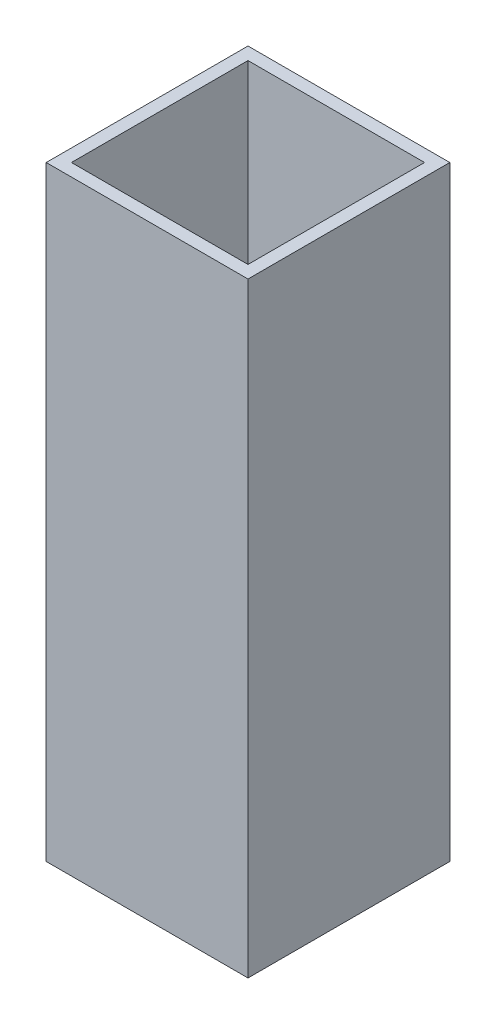
ISO-10303-21;
HEADER;
FILE_DESCRIPTION(('STEP AP214'),'2;1');
FILE_NAME('part.step','',(''),(''),'','','');
FILE_SCHEMA(('AUTOMOTIVE_DESIGN { 1 0 10303 214 1 1 1 1 }'));
ENDSEC;
DATA;
#1=APPLICATION_CONTEXT('core data for automotive mechanical design processes');
#2=APPLICATION_PROTOCOL_DEFINITION('international standard','automotive_design',2000,#1);
#3=PRODUCT_CONTEXT('',#1,'mechanical');
#4=PRODUCT('Part','Part','',(#3));
#5=PRODUCT_RELATED_PRODUCT_CATEGORY('part','',(#4));
#6=PRODUCT_DEFINITION_FORMATION('','',#4);
#7=PRODUCT_DEFINITION_CONTEXT('part definition',#1,'design');
#8=PRODUCT_DEFINITION('design','',#6,#7);
#9=PRODUCT_DEFINITION_SHAPE('','',#8);
#10=(LENGTH_UNIT() NAMED_UNIT(*) SI_UNIT(.MILLI.,.METRE.));
#11=(NAMED_UNIT(*) PLANE_ANGLE_UNIT() SI_UNIT($,.RADIAN.));
#12=(NAMED_UNIT(*) SI_UNIT($,.STERADIAN.) SOLID_ANGLE_UNIT());
#13=UNCERTAINTY_MEASURE_WITH_UNIT(LENGTH_MEASURE(1.E-05),#10,'distance_accuracy_value','');
#14=(GEOMETRIC_REPRESENTATION_CONTEXT(3) GLOBAL_UNCERTAINTY_ASSIGNED_CONTEXT((#13)) GLOBAL_UNIT_ASSIGNED_CONTEXT((#10,
#11,#12)) REPRESENTATION_CONTEXT('',''));
#15=CARTESIAN_POINT('',(0.,0.,0.));
#16=DIRECTION('',(0.,0.,1.));
#17=DIRECTION('',(1.,0.,0.));
#18=AXIS2_PLACEMENT_3D('',#15,#16,#17);
#19=CARTESIAN_POINT('',(0.,76.2,0.));
#20=DIRECTION('',(0.,-1.,0.));
#21=DIRECTION('',(0.,0.,-1.));
#22=AXIS2_PLACEMENT_3D('',#19,#20,#21);
#23=PLANE('',#22);
#24=DIRECTION('',(0.,0.,1.));
#25=VECTOR('',#24,1.);
#26=CARTESIAN_POINT('',(-12.7,76.2,-12.7));
#27=LINE('',#26,#25);
#28=CARTESIAN_POINT('',(-12.7,76.2,-12.7));
#29=VERTEX_POINT('',#28);
#30=CARTESIAN_POINT('',(-12.7,76.2,12.7));
#31=VERTEX_POINT('',#30);
#32=EDGE_CURVE('E134',#29,#31,#27,.T.);
#33=ORIENTED_EDGE('',*,*,#32,.T.);
#34=DIRECTION('',(1.,0.,0.));
#35=VECTOR('',#34,1.);
#36=CARTESIAN_POINT('',(12.7,76.2,12.7));
#37=LINE('',#36,#35);
#38=CARTESIAN_POINT('',(12.7,76.2,12.7));
#39=VERTEX_POINT('',#38);
#40=EDGE_CURVE('E137',#31,#39,#37,.T.);
#41=ORIENTED_EDGE('',*,*,#40,.T.);
#42=DIRECTION('',(0.,0.,-1.));
#43=VECTOR('',#42,1.);
#44=CARTESIAN_POINT('',(12.7,76.2,-12.7));
#45=LINE('',#44,#43);
#46=CARTESIAN_POINT('',(12.7,76.2,-12.7));
#47=VERTEX_POINT('',#46);
#48=EDGE_CURVE('E140',#39,#47,#45,.T.);
#49=ORIENTED_EDGE('',*,*,#48,.T.);
#50=DIRECTION('',(-1.,0.,0.));
#51=VECTOR('',#50,1.);
#52=CARTESIAN_POINT('',(12.7,76.2,-12.7));
#53=LINE('',#52,#51);
#54=EDGE_CURVE('E142',#47,#29,#53,.T.);
#55=ORIENTED_EDGE('',*,*,#54,.T.);
#56=EDGE_LOOP('',(#33,#41,#49,#55));
#57=FACE_BOUND('',#56,.T.);
#58=DIRECTION('',(0.,0.,1.));
#59=VECTOR('',#58,1.);
#60=CARTESIAN_POINT('',(-11.1125,76.2,-11.1125));
#61=LINE('',#60,#59);
#62=CARTESIAN_POINT('',(-11.1125,76.2,-11.1125));
#63=VERTEX_POINT('',#62);
#64=CARTESIAN_POINT('',(-11.1125,76.2,11.1125));
#65=VERTEX_POINT('',#64);
#66=EDGE_CURVE('E98',#63,#65,#61,.T.);
#67=ORIENTED_EDGE('',*,*,#66,.F.);
#68=DIRECTION('',(-1.,0.,0.));
#69=VECTOR('',#68,1.);
#70=CARTESIAN_POINT('',(11.1125,76.2,-11.1125));
#71=LINE('',#70,#69);
#72=CARTESIAN_POINT('',(11.1125,76.2,-11.1125));
#73=VERTEX_POINT('',#72);
#74=EDGE_CURVE('E120',#73,#63,#71,.T.);
#75=ORIENTED_EDGE('',*,*,#74,.F.);
#76=DIRECTION('',(0.,0.,-1.));
#77=VECTOR('',#76,1.);
#78=CARTESIAN_POINT('',(11.1125,76.2,-11.1125));
#79=LINE('',#78,#77);
#80=CARTESIAN_POINT('',(11.1125,76.2,11.1125));
#81=VERTEX_POINT('',#80);
#82=EDGE_CURVE('E118',#81,#73,#79,.T.);
#83=ORIENTED_EDGE('',*,*,#82,.F.);
#84=DIRECTION('',(1.,0.,0.));
#85=VECTOR('',#84,1.);
#86=CARTESIAN_POINT('',(11.1125,76.2,11.1125));
#87=LINE('',#86,#85);
#88=EDGE_CURVE('E106',#65,#81,#87,.T.);
#89=ORIENTED_EDGE('',*,*,#88,.F.);
#90=EDGE_LOOP('',(#67,#75,#83,#89));
#91=FACE_BOUND('',#90,.T.);
#92=ADVANCED_FACE('F33',(#57,#91),#23,.F.);
#93=CARTESIAN_POINT('',(0.,0.,0.));
#94=DIRECTION('',(0.,-1.,0.));
#95=DIRECTION('',(0.,0.,-1.));
#96=AXIS2_PLACEMENT_3D('',#93,#94,#95);
#97=PLANE('',#96);
#98=DIRECTION('',(0.,0.,1.));
#99=VECTOR('',#98,1.);
#100=CARTESIAN_POINT('',(-12.7,0.,-12.7));
#101=LINE('',#100,#99);
#102=CARTESIAN_POINT('',(-12.7,0.,-12.7));
#103=VERTEX_POINT('',#102);
#104=CARTESIAN_POINT('',(-12.7,0.,12.7));
#105=VERTEX_POINT('',#104);
#106=EDGE_CURVE('E114',#103,#105,#101,.T.);
#107=ORIENTED_EDGE('',*,*,#106,.F.);
#108=DIRECTION('',(-1.,0.,0.));
#109=VECTOR('',#108,1.);
#110=CARTESIAN_POINT('',(12.7,0.,-12.7));
#111=LINE('',#110,#109);
#112=CARTESIAN_POINT('',(12.7,0.,-12.7));
#113=VERTEX_POINT('',#112);
#114=EDGE_CURVE('E138',#113,#103,#111,.T.);
#115=ORIENTED_EDGE('',*,*,#114,.F.);
#116=DIRECTION('',(0.,0.,-1.));
#117=VECTOR('',#116,1.);
#118=CARTESIAN_POINT('',(12.7,0.,-12.7));
#119=LINE('',#118,#117);
#120=CARTESIAN_POINT('',(12.7,0.,12.7));
#121=VERTEX_POINT('',#120);
#122=EDGE_CURVE('E149',#121,#113,#119,.T.);
#123=ORIENTED_EDGE('',*,*,#122,.F.);
#124=DIRECTION('',(1.,0.,0.));
#125=VECTOR('',#124,1.);
#126=CARTESIAN_POINT('',(12.7,0.,12.7));
#127=LINE('',#126,#125);
#128=EDGE_CURVE('E147',#105,#121,#127,.T.);
#129=ORIENTED_EDGE('',*,*,#128,.F.);
#130=EDGE_LOOP('',(#107,#115,#123,#129));
#131=FACE_BOUND('',#130,.T.);
#132=DIRECTION('',(-1.,0.,0.));
#133=VECTOR('',#132,1.);
#134=CARTESIAN_POINT('',(11.1125,0.,-11.1125));
#135=LINE('',#134,#133);
#136=CARTESIAN_POINT('',(11.1125,0.,-11.1125));
#137=VERTEX_POINT('',#136);
#138=CARTESIAN_POINT('',(-11.1125,0.,-11.1125));
#139=VERTEX_POINT('',#138);
#140=EDGE_CURVE('E107',#137,#139,#135,.T.);
#141=ORIENTED_EDGE('',*,*,#140,.T.);
#142=DIRECTION('',(0.,0.,1.));
#143=VECTOR('',#142,1.);
#144=CARTESIAN_POINT('',(-11.1125,0.,-11.1125));
#145=LINE('',#144,#143);
#146=CARTESIAN_POINT('',(-11.1125,0.,11.1125));
#147=VERTEX_POINT('',#146);
#148=EDGE_CURVE('E56',#139,#147,#145,.T.);
#149=ORIENTED_EDGE('',*,*,#148,.T.);
#150=DIRECTION('',(1.,0.,0.));
#151=VECTOR('',#150,1.);
#152=CARTESIAN_POINT('',(11.1125,0.,11.1125));
#153=LINE('',#152,#151);
#154=CARTESIAN_POINT('',(11.1125,0.,11.1125));
#155=VERTEX_POINT('',#154);
#156=EDGE_CURVE('E113',#147,#155,#153,.T.);
#157=ORIENTED_EDGE('',*,*,#156,.T.);
#158=DIRECTION('',(0.,0.,-1.));
#159=VECTOR('',#158,1.);
#160=CARTESIAN_POINT('',(11.1125,0.,-11.1125));
#161=LINE('',#160,#159);
#162=EDGE_CURVE('E126',#155,#137,#161,.T.);
#163=ORIENTED_EDGE('',*,*,#162,.T.);
#164=EDGE_LOOP('',(#141,#149,#157,#163));
#165=FACE_BOUND('',#164,.T.);
#166=ADVANCED_FACE('F167',(#131,#165),#97,.T.);
#167=CARTESIAN_POINT('',(-12.7,76.2,-12.7));
#168=DIRECTION('',(1.,0.,0.));
#169=DIRECTION('',(0.,0.,-1.));
#170=AXIS2_PLACEMENT_3D('',#167,#168,#169);
#171=PLANE('',#170);
#172=ORIENTED_EDGE('',*,*,#106,.T.);
#173=DIRECTION('',(0.,-1.,0.));
#174=VECTOR('',#173,1.);
#175=CARTESIAN_POINT('',(-12.7,76.2,12.7));
#176=LINE('',#175,#174);
#177=EDGE_CURVE('E11',#31,#105,#176,.T.);
#178=ORIENTED_EDGE('',*,*,#177,.F.);
#179=ORIENTED_EDGE('',*,*,#32,.F.);
#180=DIRECTION('',(0.,-1.,0.));
#181=VECTOR('',#180,1.);
#182=CARTESIAN_POINT('',(-12.7,76.2,-12.7));
#183=LINE('',#182,#181);
#184=EDGE_CURVE('E144',#29,#103,#183,.T.);
#185=ORIENTED_EDGE('',*,*,#184,.T.);
#186=EDGE_LOOP('',(#172,#178,#179,#185));
#187=FACE_BOUND('',#186,.T.);
#188=ADVANCED_FACE('F35',(#187),#171,.F.);
#189=CARTESIAN_POINT('',(12.7,76.2,12.7));
#190=DIRECTION('',(0.,0.,-1.));
#191=DIRECTION('',(-1.,0.,0.));
#192=AXIS2_PLACEMENT_3D('',#189,#190,#191);
#193=PLANE('',#192);
#194=ORIENTED_EDGE('',*,*,#128,.T.);
#195=DIRECTION('',(0.,-1.,0.));
#196=VECTOR('',#195,1.);
#197=CARTESIAN_POINT('',(12.7,76.2,12.7));
#198=LINE('',#197,#196);
#199=EDGE_CURVE('E41',#39,#121,#198,.T.);
#200=ORIENTED_EDGE('',*,*,#199,.F.);
#201=ORIENTED_EDGE('',*,*,#40,.F.);
#202=ORIENTED_EDGE('',*,*,#177,.T.);
#203=EDGE_LOOP('',(#194,#200,#201,#202));
#204=FACE_BOUND('',#203,.T.);
#205=ADVANCED_FACE('F177',(#204),#193,.F.);
#206=CARTESIAN_POINT('',(12.7,76.2,-12.7));
#207=DIRECTION('',(-1.,0.,0.));
#208=DIRECTION('',(0.,0.,1.));
#209=AXIS2_PLACEMENT_3D('',#206,#207,#208);
#210=PLANE('',#209);
#211=ORIENTED_EDGE('',*,*,#122,.T.);
#212=DIRECTION('',(0.,-1.,0.));
#213=VECTOR('',#212,1.);
#214=CARTESIAN_POINT('',(12.7,76.2,-12.7));
#215=LINE('',#214,#213);
#216=EDGE_CURVE('E154',#47,#113,#215,.T.);
#217=ORIENTED_EDGE('',*,*,#216,.F.);
#218=ORIENTED_EDGE('',*,*,#48,.F.);
#219=ORIENTED_EDGE('',*,*,#199,.T.);
#220=EDGE_LOOP('',(#211,#217,#218,#219));
#221=FACE_BOUND('',#220,.T.);
#222=ADVANCED_FACE('F161',(#221),#210,.F.);
#223=CARTESIAN_POINT('',(12.7,76.2,-12.7));
#224=DIRECTION('',(0.,0.,1.));
#225=DIRECTION('',(1.,0.,0.));
#226=AXIS2_PLACEMENT_3D('',#223,#224,#225);
#227=PLANE('',#226);
#228=ORIENTED_EDGE('',*,*,#114,.T.);
#229=ORIENTED_EDGE('',*,*,#184,.F.);
#230=ORIENTED_EDGE('',*,*,#54,.F.);
#231=ORIENTED_EDGE('',*,*,#216,.T.);
#232=EDGE_LOOP('',(#228,#229,#230,#231));
#233=FACE_BOUND('',#232,.T.);
#234=ADVANCED_FACE('F171',(#233),#227,.F.);
#235=CARTESIAN_POINT('',(-11.1125,76.2,-11.1125));
#236=DIRECTION('',(1.,0.,0.));
#237=DIRECTION('',(0.,0.,-1.));
#238=AXIS2_PLACEMENT_3D('',#235,#236,#237);
#239=PLANE('',#238);
#240=ORIENTED_EDGE('',*,*,#148,.F.);
#241=DIRECTION('',(0.,-1.,0.));
#242=VECTOR('',#241,1.);
#243=CARTESIAN_POINT('',(-11.1125,76.2,-11.1125));
#244=LINE('',#243,#242);
#245=EDGE_CURVE('E102',#63,#139,#244,.T.);
#246=ORIENTED_EDGE('',*,*,#245,.F.);
#247=ORIENTED_EDGE('',*,*,#66,.T.);
#248=DIRECTION('',(0.,-1.,0.));
#249=VECTOR('',#248,1.);
#250=CARTESIAN_POINT('',(-11.1125,76.2,11.1125));
#251=LINE('',#250,#249);
#252=EDGE_CURVE('E101',#65,#147,#251,.T.);
#253=ORIENTED_EDGE('',*,*,#252,.T.);
#254=EDGE_LOOP('',(#240,#246,#247,#253));
#255=FACE_BOUND('',#254,.T.);
#256=ADVANCED_FACE('F100',(#255),#239,.T.);
#257=CARTESIAN_POINT('',(11.1125,76.2,11.1125));
#258=DIRECTION('',(0.,0.,-1.));
#259=DIRECTION('',(-1.,0.,0.));
#260=AXIS2_PLACEMENT_3D('',#257,#258,#259);
#261=PLANE('',#260);
#262=ORIENTED_EDGE('',*,*,#156,.F.);
#263=ORIENTED_EDGE('',*,*,#252,.F.);
#264=ORIENTED_EDGE('',*,*,#88,.T.);
#265=DIRECTION('',(0.,-1.,0.));
#266=VECTOR('',#265,1.);
#267=CARTESIAN_POINT('',(11.1125,76.2,11.1125));
#268=LINE('',#267,#266);
#269=EDGE_CURVE('E115',#81,#155,#268,.T.);
#270=ORIENTED_EDGE('',*,*,#269,.T.);
#271=EDGE_LOOP('',(#262,#263,#264,#270));
#272=FACE_BOUND('',#271,.T.);
#273=ADVANCED_FACE('F110',(#272),#261,.T.);
#274=CARTESIAN_POINT('',(11.1125,76.2,-11.1125));
#275=DIRECTION('',(-1.,0.,0.));
#276=DIRECTION('',(0.,0.,1.));
#277=AXIS2_PLACEMENT_3D('',#274,#275,#276);
#278=PLANE('',#277);
#279=ORIENTED_EDGE('',*,*,#162,.F.);
#280=ORIENTED_EDGE('',*,*,#269,.F.);
#281=ORIENTED_EDGE('',*,*,#82,.T.);
#282=DIRECTION('',(0.,-1.,0.));
#283=VECTOR('',#282,1.);
#284=CARTESIAN_POINT('',(11.1125,76.2,-11.1125));
#285=LINE('',#284,#283);
#286=EDGE_CURVE('E48',#73,#137,#285,.T.);
#287=ORIENTED_EDGE('',*,*,#286,.T.);
#288=EDGE_LOOP('',(#279,#280,#281,#287));
#289=FACE_BOUND('',#288,.T.);
#290=ADVANCED_FACE('F200',(#289),#278,.T.);
#291=CARTESIAN_POINT('',(11.1125,76.2,-11.1125));
#292=DIRECTION('',(0.,0.,1.));
#293=DIRECTION('',(1.,0.,0.));
#294=AXIS2_PLACEMENT_3D('',#291,#292,#293);
#295=PLANE('',#294);
#296=ORIENTED_EDGE('',*,*,#140,.F.);
#297=ORIENTED_EDGE('',*,*,#286,.F.);
#298=ORIENTED_EDGE('',*,*,#74,.T.);
#299=ORIENTED_EDGE('',*,*,#245,.T.);
#300=EDGE_LOOP('',(#296,#297,#298,#299));
#301=FACE_BOUND('',#300,.T.);
#302=ADVANCED_FACE('F204',(#301),#295,.T.);
#303=CLOSED_SHELL('',(#92,#166,#188,#205,#222,#234,#256,#273,#290,#302));
#304=MANIFOLD_SOLID_BREP('B2',#303);
#305=ADVANCED_BREP_SHAPE_REPRESENTATION('',(#18,#304),#14);
#306=SHAPE_DEFINITION_REPRESENTATION(#9,#305);
ENDSEC;
END-ISO-10303-21;
